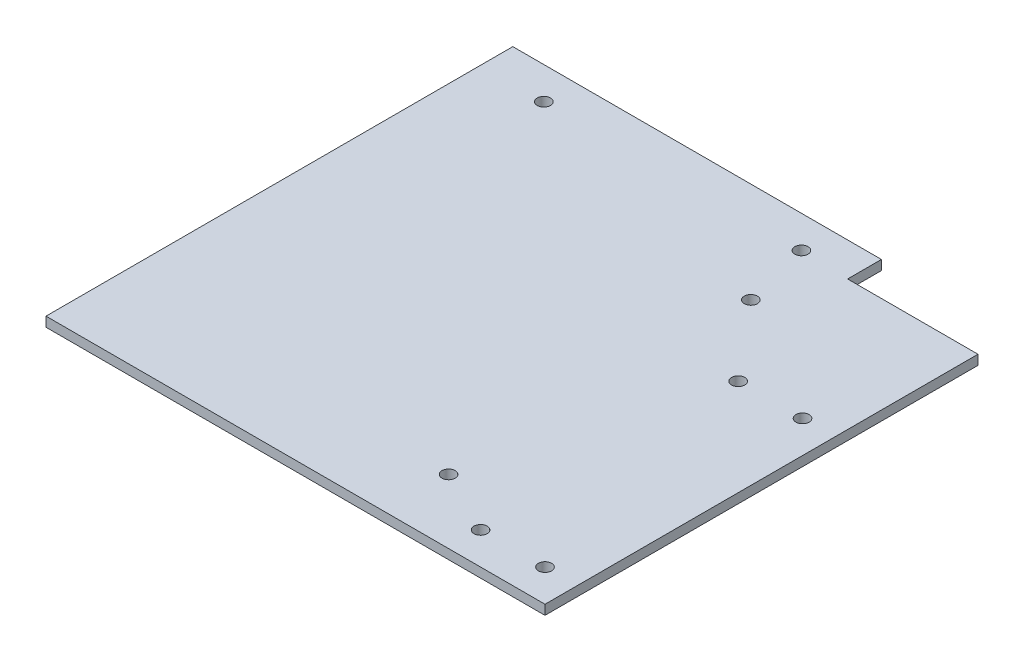
ISO-10303-21;
HEADER;
FILE_DESCRIPTION(('STEP AP214'),'2;1');
FILE_NAME('part.step','',(''),(''),'','','');
FILE_SCHEMA(('AUTOMOTIVE_DESIGN { 1 0 10303 214 1 1 1 1 }'));
ENDSEC;
DATA;
#1=APPLICATION_CONTEXT('core data for automotive mechanical design processes');
#2=APPLICATION_PROTOCOL_DEFINITION('international standard','automotive_design',2000,#1);
#3=PRODUCT_CONTEXT('',#1,'mechanical');
#4=PRODUCT('Part','Part','',(#3));
#5=PRODUCT_RELATED_PRODUCT_CATEGORY('part','',(#4));
#6=PRODUCT_DEFINITION_FORMATION('','',#4);
#7=PRODUCT_DEFINITION_CONTEXT('part definition',#1,'design');
#8=PRODUCT_DEFINITION('design','',#6,#7);
#9=PRODUCT_DEFINITION_SHAPE('','',#8);
#10=(LENGTH_UNIT() NAMED_UNIT(*) SI_UNIT(.MILLI.,.METRE.));
#11=(NAMED_UNIT(*) PLANE_ANGLE_UNIT() SI_UNIT($,.RADIAN.));
#12=(NAMED_UNIT(*) SI_UNIT($,.STERADIAN.) SOLID_ANGLE_UNIT());
#13=UNCERTAINTY_MEASURE_WITH_UNIT(LENGTH_MEASURE(1.E-05),#10,'distance_accuracy_value','');
#14=(GEOMETRIC_REPRESENTATION_CONTEXT(3) GLOBAL_UNCERTAINTY_ASSIGNED_CONTEXT((#13)) GLOBAL_UNIT_ASSIGNED_CONTEXT((#10,
#11,#12)) REPRESENTATION_CONTEXT('',''));
#15=CARTESIAN_POINT('',(0.,0.,0.));
#16=DIRECTION('',(0.,0.,1.));
#17=DIRECTION('',(1.,0.,0.));
#18=AXIS2_PLACEMENT_3D('',#15,#16,#17);
#19=CARTESIAN_POINT('',(-77.5,3.,-72.5));
#20=DIRECTION('',(1.,0.,0.));
#21=DIRECTION('',(0.,0.,-1.));
#22=AXIS2_PLACEMENT_3D('',#19,#20,#21);
#23=PLANE('',#22);
#24=DIRECTION('',(0.,0.,1.));
#25=VECTOR('',#24,1.);
#26=CARTESIAN_POINT('',(-77.5,0.,-72.5));
#27=LINE('',#26,#25);
#28=CARTESIAN_POINT('',(-77.5,0.,-72.5));
#29=VERTEX_POINT('',#28);
#30=CARTESIAN_POINT('',(-77.5,0.,72.5));
#31=VERTEX_POINT('',#30);
#32=EDGE_CURVE('E154',#29,#31,#27,.T.);
#33=ORIENTED_EDGE('',*,*,#32,.T.);
#34=DIRECTION('',(0.,-1.,0.));
#35=VECTOR('',#34,1.);
#36=CARTESIAN_POINT('',(-77.5,3.,72.5));
#37=LINE('',#36,#35);
#38=CARTESIAN_POINT('',(-77.5,3.,72.5));
#39=VERTEX_POINT('',#38);
#40=EDGE_CURVE('E12',#39,#31,#37,.T.);
#41=ORIENTED_EDGE('',*,*,#40,.F.);
#42=DIRECTION('',(0.,0.,1.));
#43=VECTOR('',#42,1.);
#44=CARTESIAN_POINT('',(-77.5,3.,-72.5));
#45=LINE('',#44,#43);
#46=CARTESIAN_POINT('',(-77.5,3.,-72.5));
#47=VERTEX_POINT('',#46);
#48=EDGE_CURVE('E167',#47,#39,#45,.T.);
#49=ORIENTED_EDGE('',*,*,#48,.F.);
#50=DIRECTION('',(0.,-1.,0.));
#51=VECTOR('',#50,1.);
#52=CARTESIAN_POINT('',(-77.5,3.,-72.5));
#53=LINE('',#52,#51);
#54=EDGE_CURVE('E150',#47,#29,#53,.T.);
#55=ORIENTED_EDGE('',*,*,#54,.T.);
#56=EDGE_LOOP('',(#33,#41,#49,#55));
#57=FACE_BOUND('',#56,.T.);
#58=ADVANCED_FACE('F43',(#57),#23,.F.);
#59=CARTESIAN_POINT('',(77.5,3.,72.5));
#60=DIRECTION('',(0.,0.,-1.));
#61=DIRECTION('',(-1.,0.,0.));
#62=AXIS2_PLACEMENT_3D('',#59,#60,#61);
#63=PLANE('',#62);
#64=DIRECTION('',(1.,0.,0.));
#65=VECTOR('',#64,1.);
#66=CARTESIAN_POINT('',(77.5,0.,72.5));
#67=LINE('',#66,#65);
#68=CARTESIAN_POINT('',(77.5,0.,72.5));
#69=VERTEX_POINT('',#68);
#70=EDGE_CURVE('E158',#31,#69,#67,.T.);
#71=ORIENTED_EDGE('',*,*,#70,.T.);
#72=DIRECTION('',(0.,-1.,0.));
#73=VECTOR('',#72,1.);
#74=CARTESIAN_POINT('',(77.5,3.,72.5));
#75=LINE('',#74,#73);
#76=CARTESIAN_POINT('',(77.5,3.,72.5));
#77=VERTEX_POINT('',#76);
#78=EDGE_CURVE('E51',#77,#69,#75,.T.);
#79=ORIENTED_EDGE('',*,*,#78,.F.);
#80=DIRECTION('',(1.,0.,0.));
#81=VECTOR('',#80,1.);
#82=CARTESIAN_POINT('',(77.5,3.,72.5));
#83=LINE('',#82,#81);
#84=EDGE_CURVE('E90',#39,#77,#83,.T.);
#85=ORIENTED_EDGE('',*,*,#84,.F.);
#86=ORIENTED_EDGE('',*,*,#40,.T.);
#87=EDGE_LOOP('',(#71,#79,#85,#86));
#88=FACE_BOUND('',#87,.T.);
#89=ADVANCED_FACE('F178',(#88),#63,.F.);
#90=CARTESIAN_POINT('',(77.5,3.,-72.5));
#91=DIRECTION('',(-1.,0.,0.));
#92=DIRECTION('',(0.,0.,1.));
#93=AXIS2_PLACEMENT_3D('',#90,#91,#92);
#94=PLANE('',#93);
#95=DIRECTION('',(0.,0.,-1.));
#96=VECTOR('',#95,1.);
#97=CARTESIAN_POINT('',(77.5,0.,-72.5));
#98=LINE('',#97,#96);
#99=CARTESIAN_POINT('',(77.5,0.,-62.0000000000006));
#100=VERTEX_POINT('',#99);
#101=EDGE_CURVE('E162',#69,#100,#98,.T.);
#102=ORIENTED_EDGE('',*,*,#101,.T.);
#103=DIRECTION('',(0.,1.,0.));
#104=VECTOR('',#103,1.);
#105=CARTESIAN_POINT('',(77.5,0.,-62.0000000000006));
#106=LINE('',#105,#104);
#107=CARTESIAN_POINT('',(77.5,3.,-62.0000000000006));
#108=VERTEX_POINT('',#107);
#109=EDGE_CURVE('E58',#100,#108,#106,.T.);
#110=ORIENTED_EDGE('',*,*,#109,.T.);
#111=DIRECTION('',(0.,0.,-1.));
#112=VECTOR('',#111,1.);
#113=CARTESIAN_POINT('',(77.5,3.,-72.5));
#114=LINE('',#113,#112);
#115=EDGE_CURVE('E151',#77,#108,#114,.T.);
#116=ORIENTED_EDGE('',*,*,#115,.F.);
#117=ORIENTED_EDGE('',*,*,#78,.T.);
#118=EDGE_LOOP('',(#102,#110,#116,#117));
#119=FACE_BOUND('',#118,.T.);
#120=ADVANCED_FACE('F175',(#119),#94,.F.);
#121=CARTESIAN_POINT('',(77.5,3.,-72.5));
#122=DIRECTION('',(0.,0.,1.));
#123=DIRECTION('',(1.,0.,0.));
#124=AXIS2_PLACEMENT_3D('',#121,#122,#123);
#125=PLANE('',#124);
#126=DIRECTION('',(-1.,0.,0.));
#127=VECTOR('',#126,1.);
#128=CARTESIAN_POINT('',(77.5,3.,-72.5));
#129=LINE('',#128,#127);
#130=CARTESIAN_POINT('',(36.9999999999999,3.,-72.5000000000006));
#131=VERTEX_POINT('',#130);
#132=EDGE_CURVE('E67',#131,#47,#129,.T.);
#133=ORIENTED_EDGE('',*,*,#132,.F.);
#134=DIRECTION('',(0.,1.,0.));
#135=VECTOR('',#134,1.);
#136=CARTESIAN_POINT('',(36.9999999999999,0.,-72.5000000000006));
#137=LINE('',#136,#135);
#138=CARTESIAN_POINT('',(36.9999999999999,0.,-72.5000000000006));
#139=VERTEX_POINT('',#138);
#140=EDGE_CURVE('E159',#139,#131,#137,.T.);
#141=ORIENTED_EDGE('',*,*,#140,.F.);
#142=DIRECTION('',(-1.,0.,0.));
#143=VECTOR('',#142,1.);
#144=CARTESIAN_POINT('',(77.5,0.,-72.5));
#145=LINE('',#144,#143);
#146=EDGE_CURVE('E85',#139,#29,#145,.T.);
#147=ORIENTED_EDGE('',*,*,#146,.T.);
#148=ORIENTED_EDGE('',*,*,#54,.F.);
#149=EDGE_LOOP('',(#133,#141,#147,#148));
#150=FACE_BOUND('',#149,.T.);
#151=ADVANCED_FACE('F181',(#150),#125,.F.);
#152=CARTESIAN_POINT('',(0.,3.,0.));
#153=DIRECTION('',(0.,-1.,0.));
#154=DIRECTION('',(0.,0.,-1.));
#155=AXIS2_PLACEMENT_3D('',#152,#153,#154);
#156=PLANE('',#155);
#157=CARTESIAN_POINT('',(27.5996333739302,3.,52.5456796533949));
#158=DIRECTION('',(0.,1.,0.));
#159=DIRECTION('',(0.,0.,1.));
#160=AXIS2_PLACEMENT_3D('',#157,#158,#159);
#161=CIRCLE('',#160,2.05);
#162=CARTESIAN_POINT('',(27.5996333739302,3.,54.5956796533949));
#163=VERTEX_POINT('',#162);
#164=EDGE_CURVE('E358',#163,#163,#161,.T.);
#165=ORIENTED_EDGE('',*,*,#164,.F.);
#166=EDGE_LOOP('',(#165));
#167=FACE_BOUND('',#166,.T.);
#168=CARTESIAN_POINT('',(27.5996333739302,3.,-41.3418257565539));
#169=DIRECTION('',(0.,1.,0.));
#170=DIRECTION('',(0.,0.,1.));
#171=AXIS2_PLACEMENT_3D('',#168,#169,#170);
#172=CIRCLE('',#171,2.05);
#173=CARTESIAN_POINT('',(27.5996333739302,3.,-39.2918257565539));
#174=VERTEX_POINT('',#173);
#175=EDGE_CURVE('E368',#174,#174,#172,.T.);
#176=ORIENTED_EDGE('',*,*,#175,.F.);
#177=EDGE_LOOP('',(#176));
#178=FACE_BOUND('',#177,.T.);
#179=CARTESIAN_POINT('',(-57.8500000000009,3.,-62.5000000000007));
#180=DIRECTION('',(0.,1.,0.));
#181=DIRECTION('',(0.,0.,1.));
#182=AXIS2_PLACEMENT_3D('',#179,#180,#181);
#183=CIRCLE('',#182,2.05);
#184=CARTESIAN_POINT('',(-57.8500000000009,3.,-60.4500000000008));
#185=VERTEX_POINT('',#184);
#186=EDGE_CURVE('E400',#185,#185,#183,.T.);
#187=ORIENTED_EDGE('',*,*,#186,.F.);
#188=EDGE_LOOP('',(#187));
#189=FACE_BOUND('',#188,.T.);
#190=CARTESIAN_POINT('',(47.4999999999985,3.,-17.5000000000005));
#191=DIRECTION('',(0.,1.,0.));
#192=DIRECTION('',(0.,0.,1.));
#193=AXIS2_PLACEMENT_3D('',#190,#191,#192);
#194=CIRCLE('',#193,2.05);
#195=CARTESIAN_POINT('',(47.4999999999985,3.,-15.4500000000005));
#196=VERTEX_POINT('',#195);
#197=EDGE_CURVE('E401',#196,#196,#194,.T.);
#198=ORIENTED_EDGE('',*,*,#197,.F.);
#199=EDGE_LOOP('',(#198));
#200=FACE_BOUND('',#199,.T.);
#201=CARTESIAN_POINT('',(67.4999999999993,3.,62.4999999999995));
#202=DIRECTION('',(0.,1.,0.));
#203=DIRECTION('',(0.,0.,1.));
#204=AXIS2_PLACEMENT_3D('',#201,#202,#203);
#205=CIRCLE('',#204,2.04999999999999);
#206=CARTESIAN_POINT('',(67.4999999999993,3.,64.5499999999995));
#207=VERTEX_POINT('',#206);
#208=EDGE_CURVE('E408',#207,#207,#205,.T.);
#209=ORIENTED_EDGE('',*,*,#208,.F.);
#210=EDGE_LOOP('',(#209));
#211=FACE_BOUND('',#210,.T.);
#212=CARTESIAN_POINT('',(47.4999999999993,3.,62.4999999999995));
#213=DIRECTION('',(0.,1.,0.));
#214=DIRECTION('',(0.,0.,1.));
#215=AXIS2_PLACEMENT_3D('',#212,#213,#214);
#216=CIRCLE('',#215,2.05);
#217=CARTESIAN_POINT('',(47.4999999999993,3.,64.5499999999995));
#218=VERTEX_POINT('',#217);
#219=EDGE_CURVE('E380',#218,#218,#216,.T.);
#220=ORIENTED_EDGE('',*,*,#219,.F.);
#221=EDGE_LOOP('',(#220));
#222=FACE_BOUND('',#221,.T.);
#223=CARTESIAN_POINT('',(22.1499999999991,3.,-62.5000000000007));
#224=DIRECTION('',(0.,1.,0.));
#225=DIRECTION('',(0.,0.,1.));
#226=AXIS2_PLACEMENT_3D('',#223,#224,#225);
#227=CIRCLE('',#226,2.05);
#228=CARTESIAN_POINT('',(22.1499999999991,3.,-60.4500000000008));
#229=VERTEX_POINT('',#228);
#230=EDGE_CURVE('E392',#229,#229,#227,.T.);
#231=ORIENTED_EDGE('',*,*,#230,.F.);
#232=EDGE_LOOP('',(#231));
#233=FACE_BOUND('',#232,.T.);
#234=CARTESIAN_POINT('',(67.4999999999985,3.,-17.5000000000005));
#235=DIRECTION('',(0.,1.,0.));
#236=DIRECTION('',(0.,0.,1.));
#237=AXIS2_PLACEMENT_3D('',#234,#235,#236);
#238=CIRCLE('',#237,2.04999999999999);
#239=CARTESIAN_POINT('',(67.4999999999985,3.,-15.4500000000005));
#240=VERTEX_POINT('',#239);
#241=EDGE_CURVE('E131',#240,#240,#238,.T.);
#242=ORIENTED_EDGE('',*,*,#241,.F.);
#243=EDGE_LOOP('',(#242));
#244=FACE_BOUND('',#243,.T.);
#245=DIRECTION('',(1.,0.,0.));
#246=VECTOR('',#245,1.);
#247=CARTESIAN_POINT('',(36.9999999999999,3.,-62.0000000000006));
#248=LINE('',#247,#246);
#249=CARTESIAN_POINT('',(36.9999999999999,3.,-62.0000000000006));
#250=VERTEX_POINT('',#249);
#251=EDGE_CURVE('E124',#250,#108,#248,.T.);
#252=ORIENTED_EDGE('',*,*,#251,.F.);
#253=DIRECTION('',(0.,0.,1.));
#254=VECTOR('',#253,1.);
#255=CARTESIAN_POINT('',(36.9999999999999,3.,-72.5000000000006));
#256=LINE('',#255,#254);
#257=EDGE_CURVE('E110',#131,#250,#256,.T.);
#258=ORIENTED_EDGE('',*,*,#257,.F.);
#259=ORIENTED_EDGE('',*,*,#132,.T.);
#260=ORIENTED_EDGE('',*,*,#48,.T.);
#261=ORIENTED_EDGE('',*,*,#84,.T.);
#262=ORIENTED_EDGE('',*,*,#115,.T.);
#263=EDGE_LOOP('',(#252,#258,#259,#260,#261,#262));
#264=FACE_BOUND('',#263,.T.);
#265=ADVANCED_FACE('F190',(#167,#178,#189,#200,#211,#222,#233,#244,#264),#156,.F.);
#266=CARTESIAN_POINT('',(0.,0.,0.));
#267=DIRECTION('',(0.,-1.,0.));
#268=DIRECTION('',(0.,0.,-1.));
#269=AXIS2_PLACEMENT_3D('',#266,#267,#268);
#270=PLANE('',#269);
#271=CARTESIAN_POINT('',(27.5996333739302,0.,52.5456796533949));
#272=DIRECTION('',(0.,1.,0.));
#273=DIRECTION('',(0.,0.,1.));
#274=AXIS2_PLACEMENT_3D('',#271,#272,#273);
#275=CIRCLE('',#274,2.05);
#276=CARTESIAN_POINT('',(27.5996333739302,0.,54.5956796533949));
#277=VERTEX_POINT('',#276);
#278=EDGE_CURVE('E356',#277,#277,#275,.T.);
#279=ORIENTED_EDGE('',*,*,#278,.T.);
#280=EDGE_LOOP('',(#279));
#281=FACE_BOUND('',#280,.T.);
#282=CARTESIAN_POINT('',(27.5996333739302,0.,-41.3418257565539));
#283=DIRECTION('',(0.,1.,0.));
#284=DIRECTION('',(0.,0.,1.));
#285=AXIS2_PLACEMENT_3D('',#282,#283,#284);
#286=CIRCLE('',#285,2.05);
#287=CARTESIAN_POINT('',(27.5996333739302,0.,-39.2918257565539));
#288=VERTEX_POINT('',#287);
#289=EDGE_CURVE('E360',#288,#288,#286,.T.);
#290=ORIENTED_EDGE('',*,*,#289,.T.);
#291=EDGE_LOOP('',(#290));
#292=FACE_BOUND('',#291,.T.);
#293=CARTESIAN_POINT('',(-57.8500000000009,0.,-62.5000000000007));
#294=DIRECTION('',(0.,1.,0.));
#295=DIRECTION('',(0.,0.,1.));
#296=AXIS2_PLACEMENT_3D('',#293,#294,#295);
#297=CIRCLE('',#296,2.05);
#298=CARTESIAN_POINT('',(-57.8500000000009,0.,-60.4500000000008));
#299=VERTEX_POINT('',#298);
#300=EDGE_CURVE('E364',#299,#299,#297,.T.);
#301=ORIENTED_EDGE('',*,*,#300,.T.);
#302=EDGE_LOOP('',(#301));
#303=FACE_BOUND('',#302,.T.);
#304=CARTESIAN_POINT('',(47.4999999999985,0.,-17.5000000000005));
#305=DIRECTION('',(0.,1.,0.));
#306=DIRECTION('',(0.,0.,1.));
#307=AXIS2_PLACEMENT_3D('',#304,#305,#306);
#308=CIRCLE('',#307,2.05);
#309=CARTESIAN_POINT('',(47.4999999999985,0.,-15.4500000000005));
#310=VERTEX_POINT('',#309);
#311=EDGE_CURVE('E406',#310,#310,#308,.T.);
#312=ORIENTED_EDGE('',*,*,#311,.T.);
#313=EDGE_LOOP('',(#312));
#314=FACE_BOUND('',#313,.T.);
#315=CARTESIAN_POINT('',(67.4999999999993,0.,62.4999999999995));
#316=DIRECTION('',(0.,1.,0.));
#317=DIRECTION('',(0.,0.,1.));
#318=AXIS2_PLACEMENT_3D('',#315,#316,#317);
#319=CIRCLE('',#318,2.04999999999999);
#320=CARTESIAN_POINT('',(67.4999999999993,0.,64.5499999999995));
#321=VERTEX_POINT('',#320);
#322=EDGE_CURVE('E385',#321,#321,#319,.T.);
#323=ORIENTED_EDGE('',*,*,#322,.T.);
#324=EDGE_LOOP('',(#323));
#325=FACE_BOUND('',#324,.T.);
#326=CARTESIAN_POINT('',(47.4999999999993,0.,62.4999999999995));
#327=DIRECTION('',(0.,1.,0.));
#328=DIRECTION('',(0.,0.,1.));
#329=AXIS2_PLACEMENT_3D('',#326,#327,#328);
#330=CIRCLE('',#329,2.05);
#331=CARTESIAN_POINT('',(47.4999999999993,0.,64.5499999999995));
#332=VERTEX_POINT('',#331);
#333=EDGE_CURVE('E386',#332,#332,#330,.T.);
#334=ORIENTED_EDGE('',*,*,#333,.T.);
#335=EDGE_LOOP('',(#334));
#336=FACE_BOUND('',#335,.T.);
#337=CARTESIAN_POINT('',(22.1499999999991,0.,-62.5000000000007));
#338=DIRECTION('',(0.,1.,0.));
#339=DIRECTION('',(0.,0.,1.));
#340=AXIS2_PLACEMENT_3D('',#337,#338,#339);
#341=CIRCLE('',#340,2.05);
#342=CARTESIAN_POINT('',(22.1499999999991,0.,-60.4500000000008));
#343=VERTEX_POINT('',#342);
#344=EDGE_CURVE('E396',#343,#343,#341,.T.);
#345=ORIENTED_EDGE('',*,*,#344,.T.);
#346=EDGE_LOOP('',(#345));
#347=FACE_BOUND('',#346,.T.);
#348=CARTESIAN_POINT('',(67.4999999999985,0.,-17.5000000000005));
#349=DIRECTION('',(0.,1.,0.));
#350=DIRECTION('',(0.,0.,1.));
#351=AXIS2_PLACEMENT_3D('',#348,#349,#350);
#352=CIRCLE('',#351,2.04999999999999);
#353=CARTESIAN_POINT('',(67.4999999999985,0.,-15.4500000000005));
#354=VERTEX_POINT('',#353);
#355=EDGE_CURVE('E137',#354,#354,#352,.T.);
#356=ORIENTED_EDGE('',*,*,#355,.T.);
#357=EDGE_LOOP('',(#356));
#358=FACE_BOUND('',#357,.T.);
#359=DIRECTION('',(0.,0.,1.));
#360=VECTOR('',#359,1.);
#361=CARTESIAN_POINT('',(36.9999999999999,0.,-72.5000000000006));
#362=LINE('',#361,#360);
#363=CARTESIAN_POINT('',(36.9999999999999,0.,-62.0000000000006));
#364=VERTEX_POINT('',#363);
#365=EDGE_CURVE('E109',#139,#364,#362,.T.);
#366=ORIENTED_EDGE('',*,*,#365,.T.);
#367=DIRECTION('',(1.,0.,0.));
#368=VECTOR('',#367,1.);
#369=CARTESIAN_POINT('',(36.9999999999999,0.,-62.0000000000006));
#370=LINE('',#369,#368);
#371=EDGE_CURVE('E113',#364,#100,#370,.T.);
#372=ORIENTED_EDGE('',*,*,#371,.T.);
#373=ORIENTED_EDGE('',*,*,#101,.F.);
#374=ORIENTED_EDGE('',*,*,#70,.F.);
#375=ORIENTED_EDGE('',*,*,#32,.F.);
#376=ORIENTED_EDGE('',*,*,#146,.F.);
#377=EDGE_LOOP('',(#366,#372,#373,#374,#375,#376));
#378=FACE_BOUND('',#377,.T.);
#379=ADVANCED_FACE('F121',(#281,#292,#303,#314,#325,#336,#347,#358,#378),#270,.T.);
#380=CARTESIAN_POINT('',(36.9999999999999,0.,-72.5000000000006));
#381=DIRECTION('',(-1.,0.,0.));
#382=DIRECTION('',(0.,0.,1.));
#383=AXIS2_PLACEMENT_3D('',#380,#381,#382);
#384=PLANE('',#383);
#385=ORIENTED_EDGE('',*,*,#257,.T.);
#386=DIRECTION('',(0.,1.,0.));
#387=VECTOR('',#386,1.);
#388=CARTESIAN_POINT('',(36.9999999999999,0.,-62.0000000000006));
#389=LINE('',#388,#387);
#390=EDGE_CURVE('E106',#364,#250,#389,.T.);
#391=ORIENTED_EDGE('',*,*,#390,.F.);
#392=ORIENTED_EDGE('',*,*,#365,.F.);
#393=ORIENTED_EDGE('',*,*,#140,.T.);
#394=EDGE_LOOP('',(#385,#391,#392,#393));
#395=FACE_BOUND('',#394,.T.);
#396=ADVANCED_FACE('F107',(#395),#384,.F.);
#397=CARTESIAN_POINT('',(36.9999999999999,0.,-62.0000000000006));
#398=DIRECTION('',(0.,0.,1.));
#399=DIRECTION('',(1.,0.,0.));
#400=AXIS2_PLACEMENT_3D('',#397,#398,#399);
#401=PLANE('',#400);
#402=ORIENTED_EDGE('',*,*,#251,.T.);
#403=ORIENTED_EDGE('',*,*,#109,.F.);
#404=ORIENTED_EDGE('',*,*,#371,.F.);
#405=ORIENTED_EDGE('',*,*,#390,.T.);
#406=EDGE_LOOP('',(#402,#403,#404,#405));
#407=FACE_BOUND('',#406,.T.);
#408=ADVANCED_FACE('F115',(#407),#401,.F.);
#409=CARTESIAN_POINT('',(67.4999999999985,0.,-17.5000000000005));
#410=DIRECTION('',(0.,1.,0.));
#411=DIRECTION('',(0.,0.,1.));
#412=AXIS2_PLACEMENT_3D('',#409,#410,#411);
#413=CYLINDRICAL_SURFACE('',#412,2.04999999999999);
#414=ORIENTED_EDGE('',*,*,#355,.F.);
#415=EDGE_LOOP('',(#414));
#416=FACE_BOUND('',#415,.T.);
#417=ORIENTED_EDGE('',*,*,#241,.T.);
#418=EDGE_LOOP('',(#417));
#419=FACE_BOUND('',#418,.T.);
#420=ADVANCED_FACE('F240',(#416,#419),#413,.F.);
#421=CARTESIAN_POINT('',(22.1499999999991,0.,-62.5000000000007));
#422=DIRECTION('',(0.,1.,0.));
#423=DIRECTION('',(0.,0.,1.));
#424=AXIS2_PLACEMENT_3D('',#421,#422,#423);
#425=CYLINDRICAL_SURFACE('',#424,2.05);
#426=ORIENTED_EDGE('',*,*,#344,.F.);
#427=EDGE_LOOP('',(#426));
#428=FACE_BOUND('',#427,.T.);
#429=ORIENTED_EDGE('',*,*,#230,.T.);
#430=EDGE_LOOP('',(#429));
#431=FACE_BOUND('',#430,.T.);
#432=ADVANCED_FACE('F248',(#428,#431),#425,.F.);
#433=CARTESIAN_POINT('',(47.4999999999993,0.,62.4999999999995));
#434=DIRECTION('',(0.,1.,0.));
#435=DIRECTION('',(0.,0.,1.));
#436=AXIS2_PLACEMENT_3D('',#433,#434,#435);
#437=CYLINDRICAL_SURFACE('',#436,2.05);
#438=ORIENTED_EDGE('',*,*,#333,.F.);
#439=EDGE_LOOP('',(#438));
#440=FACE_BOUND('',#439,.T.);
#441=ORIENTED_EDGE('',*,*,#219,.T.);
#442=EDGE_LOOP('',(#441));
#443=FACE_BOUND('',#442,.T.);
#444=ADVANCED_FACE('F257',(#440,#443),#437,.F.);
#445=CARTESIAN_POINT('',(67.4999999999993,0.,62.4999999999995));
#446=DIRECTION('',(0.,1.,0.));
#447=DIRECTION('',(0.,0.,1.));
#448=AXIS2_PLACEMENT_3D('',#445,#446,#447);
#449=CYLINDRICAL_SURFACE('',#448,2.04999999999999);
#450=ORIENTED_EDGE('',*,*,#322,.F.);
#451=EDGE_LOOP('',(#450));
#452=FACE_BOUND('',#451,.T.);
#453=ORIENTED_EDGE('',*,*,#208,.T.);
#454=EDGE_LOOP('',(#453));
#455=FACE_BOUND('',#454,.T.);
#456=ADVANCED_FACE('F266',(#452,#455),#449,.F.);
#457=CARTESIAN_POINT('',(47.4999999999985,0.,-17.5000000000005));
#458=DIRECTION('',(0.,1.,0.));
#459=DIRECTION('',(0.,0.,1.));
#460=AXIS2_PLACEMENT_3D('',#457,#458,#459);
#461=CYLINDRICAL_SURFACE('',#460,2.05);
#462=ORIENTED_EDGE('',*,*,#311,.F.);
#463=EDGE_LOOP('',(#462));
#464=FACE_BOUND('',#463,.T.);
#465=ORIENTED_EDGE('',*,*,#197,.T.);
#466=EDGE_LOOP('',(#465));
#467=FACE_BOUND('',#466,.T.);
#468=ADVANCED_FACE('F275',(#464,#467),#461,.F.);
#469=CARTESIAN_POINT('',(-57.8500000000009,0.,-62.5000000000007));
#470=DIRECTION('',(0.,1.,0.));
#471=DIRECTION('',(0.,0.,1.));
#472=AXIS2_PLACEMENT_3D('',#469,#470,#471);
#473=CYLINDRICAL_SURFACE('',#472,2.05);
#474=ORIENTED_EDGE('',*,*,#300,.F.);
#475=EDGE_LOOP('',(#474));
#476=FACE_BOUND('',#475,.T.);
#477=ORIENTED_EDGE('',*,*,#186,.T.);
#478=EDGE_LOOP('',(#477));
#479=FACE_BOUND('',#478,.T.);
#480=ADVANCED_FACE('F284',(#476,#479),#473,.F.);
#481=CARTESIAN_POINT('',(27.5996333739302,0.,-41.3418257565539));
#482=DIRECTION('',(0.,1.,0.));
#483=DIRECTION('',(0.,0.,1.));
#484=AXIS2_PLACEMENT_3D('',#481,#482,#483);
#485=CYLINDRICAL_SURFACE('',#484,2.05);
#486=ORIENTED_EDGE('',*,*,#289,.F.);
#487=EDGE_LOOP('',(#486));
#488=FACE_BOUND('',#487,.T.);
#489=ORIENTED_EDGE('',*,*,#175,.T.);
#490=EDGE_LOOP('',(#489));
#491=FACE_BOUND('',#490,.T.);
#492=ADVANCED_FACE('F292',(#488,#491),#485,.F.);
#493=CARTESIAN_POINT('',(27.5996333739302,0.,52.5456796533949));
#494=DIRECTION('',(0.,1.,0.));
#495=DIRECTION('',(0.,0.,1.));
#496=AXIS2_PLACEMENT_3D('',#493,#494,#495);
#497=CYLINDRICAL_SURFACE('',#496,2.05);
#498=ORIENTED_EDGE('',*,*,#278,.F.);
#499=EDGE_LOOP('',(#498));
#500=FACE_BOUND('',#499,.T.);
#501=ORIENTED_EDGE('',*,*,#164,.T.);
#502=EDGE_LOOP('',(#501));
#503=FACE_BOUND('',#502,.T.);
#504=ADVANCED_FACE('F300',(#500,#503),#497,.F.);
#505=CLOSED_SHELL('',(#58,#89,#120,#151,#265,#379,#396,#408,#420,#432,#444,#456,#468,#480,#492,#504));
#506=MANIFOLD_SOLID_BREP('B2',#505);
#507=ADVANCED_BREP_SHAPE_REPRESENTATION('',(#18,#506),#14);
#508=SHAPE_DEFINITION_REPRESENTATION(#9,#507);
ENDSEC;
END-ISO-10303-21;
